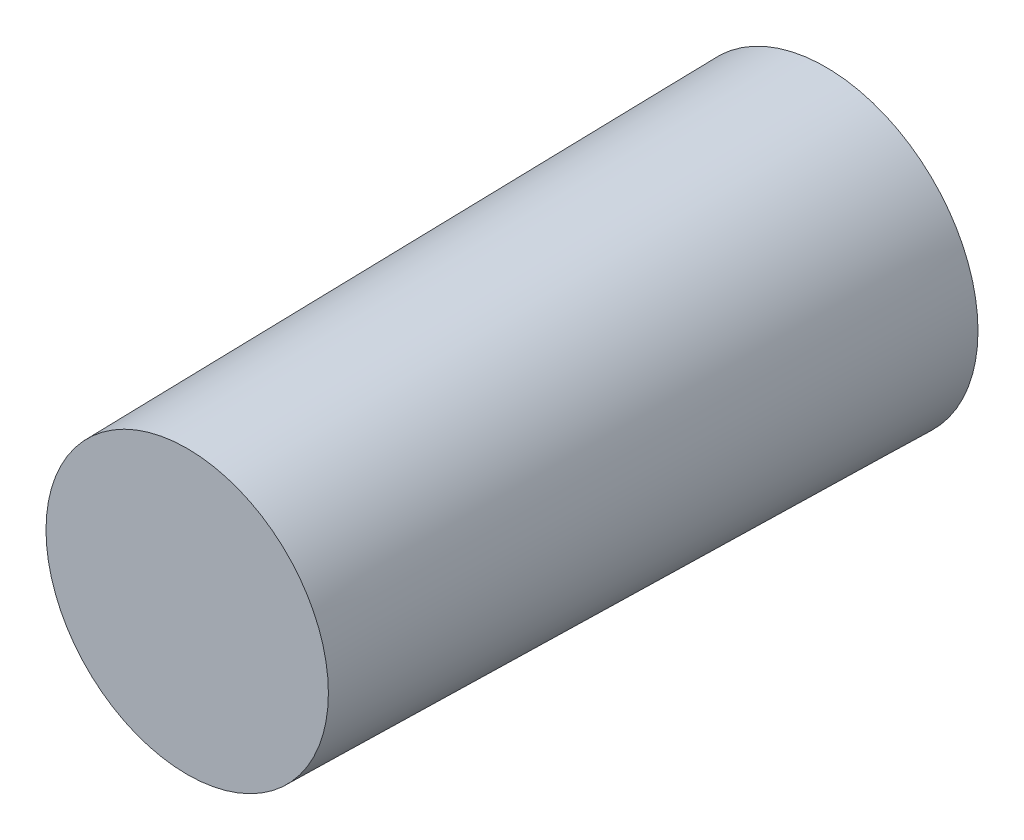
ISO-10303-21;
HEADER;
FILE_DESCRIPTION(('STEP AP214'),'2;1');
FILE_NAME('part.step','',(''),(''),'','','');
FILE_SCHEMA(('AUTOMOTIVE_DESIGN { 1 0 10303 214 1 1 1 1 }'));
ENDSEC;
DATA;
#1=APPLICATION_CONTEXT('core data for automotive mechanical design processes');
#2=APPLICATION_PROTOCOL_DEFINITION('international standard','automotive_design',2000,#1);
#3=PRODUCT_CONTEXT('',#1,'mechanical');
#4=PRODUCT('Part','Part','',(#3));
#5=PRODUCT_RELATED_PRODUCT_CATEGORY('part','',(#4));
#6=PRODUCT_DEFINITION_FORMATION('','',#4);
#7=PRODUCT_DEFINITION_CONTEXT('part definition',#1,'design');
#8=PRODUCT_DEFINITION('design','',#6,#7);
#9=PRODUCT_DEFINITION_SHAPE('','',#8);
#10=(LENGTH_UNIT() NAMED_UNIT(*) SI_UNIT(.MILLI.,.METRE.));
#11=(NAMED_UNIT(*) PLANE_ANGLE_UNIT() SI_UNIT($,.RADIAN.));
#12=(NAMED_UNIT(*) SI_UNIT($,.STERADIAN.) SOLID_ANGLE_UNIT());
#13=UNCERTAINTY_MEASURE_WITH_UNIT(LENGTH_MEASURE(1.E-05),#10,'distance_accuracy_value','');
#14=(GEOMETRIC_REPRESENTATION_CONTEXT(3) GLOBAL_UNCERTAINTY_ASSIGNED_CONTEXT((#13)) GLOBAL_UNIT_ASSIGNED_CONTEXT((#10,
#11,#12)) REPRESENTATION_CONTEXT('',''));
#15=CARTESIAN_POINT('',(0.,0.,0.));
#16=DIRECTION('',(0.,0.,1.));
#17=DIRECTION('',(1.,0.,0.));
#18=AXIS2_PLACEMENT_3D('',#15,#16,#17);
#19=CARTESIAN_POINT('',(0.,0.,13.));
#20=DIRECTION('',(0.,0.,-1.));
#21=DIRECTION('',(1.,0.,0.));
#22=AXIS2_PLACEMENT_3D('',#19,#20,#21);
#23=CONICAL_SURFACE('',#22,2.875,0.0174532925199433);
#24=CARTESIAN_POINT('',(0.,0.,13.));
#25=DIRECTION('',(0.,0.,1.));
#26=DIRECTION('',(1.,0.,0.));
#27=AXIS2_PLACEMENT_3D('',#24,#25,#26);
#28=CIRCLE('',#27,2.875);
#29=CARTESIAN_POINT('',(2.875,0.,13.));
#30=VERTEX_POINT('',#29);
#31=EDGE_CURVE('E10',#30,#30,#28,.T.);
#32=ORIENTED_EDGE('',*,*,#31,.F.);
#33=EDGE_LOOP('',(#32));
#34=FACE_BOUND('',#33,.T.);
#35=CARTESIAN_POINT('',(0.,0.,0.));
#36=DIRECTION('',(0.,0.,1.));
#37=DIRECTION('',(1.,0.,0.));
#38=AXIS2_PLACEMENT_3D('',#35,#36,#37);
#39=CIRCLE('',#38,3.10191584406683);
#40=CARTESIAN_POINT('',(3.10191584406683,0.,0.));
#41=VERTEX_POINT('',#40);
#42=EDGE_CURVE('E46',#41,#41,#39,.T.);
#43=ORIENTED_EDGE('',*,*,#42,.T.);
#44=EDGE_LOOP('',(#43));
#45=FACE_BOUND('',#44,.T.);
#46=ADVANCED_FACE('F43',(#34,#45),#23,.T.);
#47=CARTESIAN_POINT('',(0.,0.,13.));
#48=DIRECTION('',(0.,0.,1.));
#49=DIRECTION('',(1.,0.,0.));
#50=AXIS2_PLACEMENT_3D('',#47,#48,#49);
#51=PLANE('',#50);
#52=ORIENTED_EDGE('',*,*,#31,.T.);
#53=EDGE_LOOP('',(#52));
#54=FACE_BOUND('',#53,.T.);
#55=ADVANCED_FACE('F60',(#54),#51,.T.);
#56=CARTESIAN_POINT('',(0.,0.,0.));
#57=DIRECTION('',(0.,0.,1.));
#58=DIRECTION('',(1.,0.,0.));
#59=AXIS2_PLACEMENT_3D('',#56,#57,#58);
#60=PLANE('',#59);
#61=ORIENTED_EDGE('',*,*,#42,.F.);
#62=EDGE_LOOP('',(#61));
#63=FACE_BOUND('',#62,.T.);
#64=ADVANCED_FACE('F58',(#63),#60,.F.);
#65=CLOSED_SHELL('',(#46,#55,#64));
#66=MANIFOLD_SOLID_BREP('B2',#65);
#67=ADVANCED_BREP_SHAPE_REPRESENTATION('',(#18,#66),#14);
#68=SHAPE_DEFINITION_REPRESENTATION(#9,#67);
ENDSEC;
END-ISO-10303-21;
